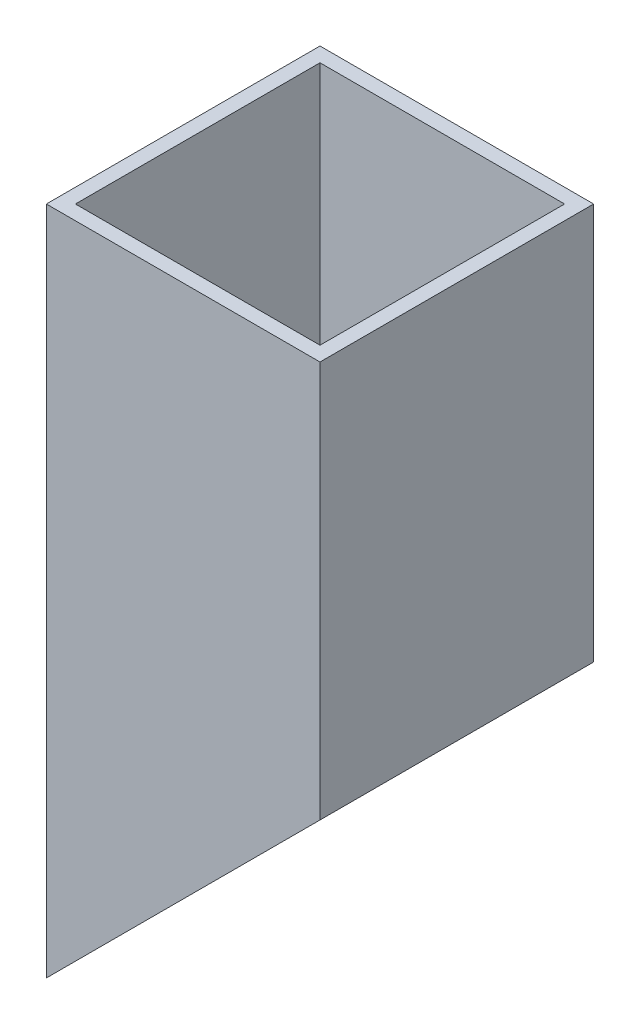
ISO-10303-21;
HEADER;
FILE_DESCRIPTION(('STEP AP214'),'2;1');
FILE_NAME('part.step','',(''),(''),'','','');
FILE_SCHEMA(('AUTOMOTIVE_DESIGN { 1 0 10303 214 1 1 1 1 }'));
ENDSEC;
DATA;
#1=APPLICATION_CONTEXT('core data for automotive mechanical design processes');
#2=APPLICATION_PROTOCOL_DEFINITION('international standard','automotive_design',2000,#1);
#3=PRODUCT_CONTEXT('',#1,'mechanical');
#4=PRODUCT('Part','Part','',(#3));
#5=PRODUCT_RELATED_PRODUCT_CATEGORY('part','',(#4));
#6=PRODUCT_DEFINITION_FORMATION('','',#4);
#7=PRODUCT_DEFINITION_CONTEXT('part definition',#1,'design');
#8=PRODUCT_DEFINITION('design','',#6,#7);
#9=PRODUCT_DEFINITION_SHAPE('','',#8);
#10=(LENGTH_UNIT() NAMED_UNIT(*) SI_UNIT(.MILLI.,.METRE.));
#11=(NAMED_UNIT(*) PLANE_ANGLE_UNIT() SI_UNIT($,.RADIAN.));
#12=(NAMED_UNIT(*) SI_UNIT($,.STERADIAN.) SOLID_ANGLE_UNIT());
#13=UNCERTAINTY_MEASURE_WITH_UNIT(LENGTH_MEASURE(1.E-05),#10,'distance_accuracy_value','');
#14=(GEOMETRIC_REPRESENTATION_CONTEXT(3) GLOBAL_UNCERTAINTY_ASSIGNED_CONTEXT((#13)) GLOBAL_UNIT_ASSIGNED_CONTEXT((#10,
#11,#12)) REPRESENTATION_CONTEXT('',''));
#15=CARTESIAN_POINT('',(0.,0.,0.));
#16=DIRECTION('',(0.,0.,1.));
#17=DIRECTION('',(1.,0.,0.));
#18=AXIS2_PLACEMENT_3D('',#15,#16,#17);
#19=CARTESIAN_POINT('',(0.,81.9,0.));
#20=DIRECTION('',(0.,-1.,0.));
#21=DIRECTION('',(0.,0.,-1.));
#22=AXIS2_PLACEMENT_3D('',#19,#20,#21);
#23=PLANE('',#22);
#24=DIRECTION('',(0.,0.,1.));
#25=VECTOR('',#24,1.);
#26=CARTESIAN_POINT('',(0.,81.9,0.));
#27=LINE('',#26,#25);
#28=CARTESIAN_POINT('',(0.,81.9,-56.5));
#29=VERTEX_POINT('',#28);
#30=CARTESIAN_POINT('',(0.,81.9,0.));
#31=VERTEX_POINT('',#30);
#32=EDGE_CURVE('E139',#29,#31,#27,.T.);
#33=ORIENTED_EDGE('',*,*,#32,.T.);
#34=DIRECTION('',(1.,0.,0.));
#35=VECTOR('',#34,1.);
#36=CARTESIAN_POINT('',(0.,81.9,0.));
#37=LINE('',#36,#35);
#38=CARTESIAN_POINT('',(56.5,81.9,0.));
#39=VERTEX_POINT('',#38);
#40=EDGE_CURVE('E142',#31,#39,#37,.T.);
#41=ORIENTED_EDGE('',*,*,#40,.T.);
#42=DIRECTION('',(0.,0.,-1.));
#43=VECTOR('',#42,1.);
#44=CARTESIAN_POINT('',(56.5,81.9,0.));
#45=LINE('',#44,#43);
#46=CARTESIAN_POINT('',(56.5,81.9,-56.5));
#47=VERTEX_POINT('',#46);
#48=EDGE_CURVE('E144',#39,#47,#45,.T.);
#49=ORIENTED_EDGE('',*,*,#48,.T.);
#50=DIRECTION('',(-1.,0.,0.));
#51=VECTOR('',#50,1.);
#52=CARTESIAN_POINT('',(0.,81.9,-56.5));
#53=LINE('',#52,#51);
#54=EDGE_CURVE('E146',#47,#29,#53,.T.);
#55=ORIENTED_EDGE('',*,*,#54,.T.);
#56=EDGE_LOOP('',(#33,#41,#49,#55));
#57=FACE_BOUND('',#56,.T.);
#58=DIRECTION('',(0.,0.,1.));
#59=VECTOR('',#58,1.);
#60=CARTESIAN_POINT('',(3.,81.9,0.));
#61=LINE('',#60,#59);
#62=CARTESIAN_POINT('',(2.99999999999999,81.9,-53.5));
#63=VERTEX_POINT('',#62);
#64=CARTESIAN_POINT('',(3.,81.9,-3.));
#65=VERTEX_POINT('',#64);
#66=EDGE_CURVE('E119',#63,#65,#61,.T.);
#67=ORIENTED_EDGE('',*,*,#66,.F.);
#68=DIRECTION('',(-1.,0.,0.));
#69=VECTOR('',#68,1.);
#70=CARTESIAN_POINT('',(0.,81.9,-53.5));
#71=LINE('',#70,#69);
#72=CARTESIAN_POINT('',(53.5,81.9,-53.5));
#73=VERTEX_POINT('',#72);
#74=EDGE_CURVE('E105',#73,#63,#71,.T.);
#75=ORIENTED_EDGE('',*,*,#74,.F.);
#76=DIRECTION('',(0.,0.,-1.));
#77=VECTOR('',#76,1.);
#78=CARTESIAN_POINT('',(53.5,81.9,0.));
#79=LINE('',#78,#77);
#80=CARTESIAN_POINT('',(53.5,81.9,-3.));
#81=VERTEX_POINT('',#80);
#82=EDGE_CURVE('E127',#81,#73,#79,.T.);
#83=ORIENTED_EDGE('',*,*,#82,.F.);
#84=DIRECTION('',(1.,0.,0.));
#85=VECTOR('',#84,1.);
#86=CARTESIAN_POINT('',(0.,81.9,-3.));
#87=LINE('',#86,#85);
#88=EDGE_CURVE('E125',#65,#81,#87,.T.);
#89=ORIENTED_EDGE('',*,*,#88,.F.);
#90=EDGE_LOOP('',(#67,#75,#83,#89));
#91=FACE_BOUND('',#90,.T.);
#92=ADVANCED_FACE('F35',(#57,#91),#23,.F.);
#93=CARTESIAN_POINT('',(0.,-56.4999999999994,-136.403066274079));
#94=DIRECTION('',(0.707106781186544,-0.707106781186551,0.));
#95=DIRECTION('',(0.707106781186551,0.707106781186544,0.));
#96=AXIS2_PLACEMENT_3D('',#93,#94,#95);
#97=PLANE('',#96);
#98=DIRECTION('',(-0.707106781186551,-0.707106781186544,0.));
#99=VECTOR('',#98,1.);
#100=CARTESIAN_POINT('',(0.,-56.4999999999994,-56.5));
#101=LINE('',#100,#99);
#102=CARTESIAN_POINT('',(56.5,0.,-56.5));
#103=VERTEX_POINT('',#102);
#104=CARTESIAN_POINT('',(0.,-56.4999999999994,-56.5));
#105=VERTEX_POINT('',#104);
#106=EDGE_CURVE('E130',#103,#105,#101,.T.);
#107=ORIENTED_EDGE('',*,*,#106,.F.);
#108=DIRECTION('',(0.,0.,-1.));
#109=VECTOR('',#108,1.);
#110=CARTESIAN_POINT('',(56.5,0.,0.));
#111=LINE('',#110,#109);
#112=CARTESIAN_POINT('',(56.5,0.,0.));
#113=VERTEX_POINT('',#112);
#114=EDGE_CURVE('E133',#113,#103,#111,.T.);
#115=ORIENTED_EDGE('',*,*,#114,.F.);
#116=DIRECTION('',(0.707106781186551,0.707106781186544,0.));
#117=VECTOR('',#116,1.);
#118=CARTESIAN_POINT('',(0.,-56.4999999999994,0.));
#119=LINE('',#118,#117);
#120=CARTESIAN_POINT('',(0.,-56.4999999999994,0.));
#121=VERTEX_POINT('',#120);
#122=EDGE_CURVE('E135',#121,#113,#119,.T.);
#123=ORIENTED_EDGE('',*,*,#122,.F.);
#124=DIRECTION('',(0.,0.,1.));
#125=VECTOR('',#124,1.);
#126=CARTESIAN_POINT('',(0.,-56.4999999999994,-136.403066274079));
#127=LINE('',#126,#125);
#128=EDGE_CURVE('E134',#105,#121,#127,.T.);
#129=ORIENTED_EDGE('',*,*,#128,.F.);
#130=EDGE_LOOP('',(#107,#115,#123,#129));
#131=FACE_BOUND('',#130,.T.);
#132=DIRECTION('',(0.,0.,-1.));
#133=VECTOR('',#132,1.);
#134=CARTESIAN_POINT('',(53.5,-2.99999999999998,-136.403066274079));
#135=LINE('',#134,#133);
#136=CARTESIAN_POINT('',(53.5,-2.99999999999997,-3.));
#137=VERTEX_POINT('',#136);
#138=CARTESIAN_POINT('',(53.5,-2.99999999999997,-53.5));
#139=VERTEX_POINT('',#138);
#140=EDGE_CURVE('E117',#137,#139,#135,.T.);
#141=ORIENTED_EDGE('',*,*,#140,.T.);
#142=DIRECTION('',(-0.707106781186551,-0.707106781186544,0.));
#143=VECTOR('',#142,1.);
#144=CARTESIAN_POINT('',(0.,-56.4999999999994,-53.5));
#145=LINE('',#144,#143);
#146=CARTESIAN_POINT('',(2.99999999999999,-53.4999999999995,-53.5));
#147=VERTEX_POINT('',#146);
#148=EDGE_CURVE('E103',#139,#147,#145,.T.);
#149=ORIENTED_EDGE('',*,*,#148,.T.);
#150=DIRECTION('',(0.,0.,1.));
#151=VECTOR('',#150,1.);
#152=CARTESIAN_POINT('',(2.99999999999998,-53.4999999999995,-136.403066274079));
#153=LINE('',#152,#151);
#154=CARTESIAN_POINT('',(3.,-53.4999999999994,-3.));
#155=VERTEX_POINT('',#154);
#156=EDGE_CURVE('E110',#147,#155,#153,.T.);
#157=ORIENTED_EDGE('',*,*,#156,.T.);
#158=DIRECTION('',(0.707106781186551,0.707106781186544,0.));
#159=VECTOR('',#158,1.);
#160=CARTESIAN_POINT('',(0.,-56.4999999999994,-3.));
#161=LINE('',#160,#159);
#162=EDGE_CURVE('E58',#155,#137,#161,.T.);
#163=ORIENTED_EDGE('',*,*,#162,.T.);
#164=EDGE_LOOP('',(#141,#149,#157,#163));
#165=FACE_BOUND('',#164,.T.);
#166=ADVANCED_FACE('F116',(#131,#165),#97,.T.);
#167=CARTESIAN_POINT('',(0.,81.9,0.));
#168=DIRECTION('',(1.,0.,0.));
#169=DIRECTION('',(0.,0.,-1.));
#170=AXIS2_PLACEMENT_3D('',#167,#168,#169);
#171=PLANE('',#170);
#172=DIRECTION('',(0.,-1.,0.));
#173=VECTOR('',#172,1.);
#174=CARTESIAN_POINT('',(0.,81.9,-56.5));
#175=LINE('',#174,#173);
#176=EDGE_CURVE('E148',#29,#105,#175,.T.);
#177=ORIENTED_EDGE('',*,*,#176,.T.);
#178=ORIENTED_EDGE('',*,*,#128,.T.);
#179=DIRECTION('',(0.,-1.,0.));
#180=VECTOR('',#179,1.);
#181=CARTESIAN_POINT('',(0.,81.9,0.));
#182=LINE('',#181,#180);
#183=EDGE_CURVE('E11',#31,#121,#182,.T.);
#184=ORIENTED_EDGE('',*,*,#183,.F.);
#185=ORIENTED_EDGE('',*,*,#32,.F.);
#186=EDGE_LOOP('',(#177,#178,#184,#185));
#187=FACE_BOUND('',#186,.T.);
#188=ADVANCED_FACE('F37',(#187),#171,.F.);
#189=CARTESIAN_POINT('',(0.,81.9,0.));
#190=DIRECTION('',(0.,0.,-1.));
#191=DIRECTION('',(-1.,0.,0.));
#192=AXIS2_PLACEMENT_3D('',#189,#190,#191);
#193=PLANE('',#192);
#194=ORIENTED_EDGE('',*,*,#183,.T.);
#195=ORIENTED_EDGE('',*,*,#122,.T.);
#196=DIRECTION('',(0.,-1.,0.));
#197=VECTOR('',#196,1.);
#198=CARTESIAN_POINT('',(56.5,81.9,0.));
#199=LINE('',#198,#197);
#200=EDGE_CURVE('E43',#39,#113,#199,.T.);
#201=ORIENTED_EDGE('',*,*,#200,.F.);
#202=ORIENTED_EDGE('',*,*,#40,.F.);
#203=EDGE_LOOP('',(#194,#195,#201,#202));
#204=FACE_BOUND('',#203,.T.);
#205=ADVANCED_FACE('F162',(#204),#193,.F.);
#206=CARTESIAN_POINT('',(56.5,81.9,0.));
#207=DIRECTION('',(-1.,0.,0.));
#208=DIRECTION('',(0.,0.,1.));
#209=AXIS2_PLACEMENT_3D('',#206,#207,#208);
#210=PLANE('',#209);
#211=ORIENTED_EDGE('',*,*,#114,.T.);
#212=DIRECTION('',(0.,-1.,0.));
#213=VECTOR('',#212,1.);
#214=CARTESIAN_POINT('',(56.5,81.9,-56.5));
#215=LINE('',#214,#213);
#216=EDGE_CURVE('E152',#47,#103,#215,.T.);
#217=ORIENTED_EDGE('',*,*,#216,.F.);
#218=ORIENTED_EDGE('',*,*,#48,.F.);
#219=ORIENTED_EDGE('',*,*,#200,.T.);
#220=EDGE_LOOP('',(#211,#217,#218,#219));
#221=FACE_BOUND('',#220,.T.);
#222=ADVANCED_FACE('F158',(#221),#210,.F.);
#223=CARTESIAN_POINT('',(0.,81.9,-56.5));
#224=DIRECTION('',(0.,0.,1.));
#225=DIRECTION('',(1.,0.,0.));
#226=AXIS2_PLACEMENT_3D('',#223,#224,#225);
#227=PLANE('',#226);
#228=ORIENTED_EDGE('',*,*,#216,.T.);
#229=ORIENTED_EDGE('',*,*,#106,.T.);
#230=ORIENTED_EDGE('',*,*,#176,.F.);
#231=ORIENTED_EDGE('',*,*,#54,.F.);
#232=EDGE_LOOP('',(#228,#229,#230,#231));
#233=FACE_BOUND('',#232,.T.);
#234=ADVANCED_FACE('F169',(#233),#227,.F.);
#235=CARTESIAN_POINT('',(3.,81.9,0.));
#236=DIRECTION('',(1.,0.,0.));
#237=DIRECTION('',(0.,0.,-1.));
#238=AXIS2_PLACEMENT_3D('',#235,#236,#237);
#239=PLANE('',#238);
#240=DIRECTION('',(0.,-1.,0.));
#241=VECTOR('',#240,1.);
#242=CARTESIAN_POINT('',(2.99999999999999,81.9,-53.5));
#243=LINE('',#242,#241);
#244=EDGE_CURVE('E99',#63,#147,#243,.T.);
#245=ORIENTED_EDGE('',*,*,#244,.F.);
#246=ORIENTED_EDGE('',*,*,#66,.T.);
#247=DIRECTION('',(0.,-1.,0.));
#248=VECTOR('',#247,1.);
#249=CARTESIAN_POINT('',(3.,81.9,-3.));
#250=LINE('',#249,#248);
#251=EDGE_CURVE('E112',#65,#155,#250,.T.);
#252=ORIENTED_EDGE('',*,*,#251,.T.);
#253=ORIENTED_EDGE('',*,*,#156,.F.);
#254=EDGE_LOOP('',(#245,#246,#252,#253));
#255=FACE_BOUND('',#254,.T.);
#256=ADVANCED_FACE('F111',(#255),#239,.T.);
#257=CARTESIAN_POINT('',(0.,81.9,-3.));
#258=DIRECTION('',(0.,0.,-1.));
#259=DIRECTION('',(-1.,0.,0.));
#260=AXIS2_PLACEMENT_3D('',#257,#258,#259);
#261=PLANE('',#260);
#262=ORIENTED_EDGE('',*,*,#251,.F.);
#263=ORIENTED_EDGE('',*,*,#88,.T.);
#264=DIRECTION('',(0.,-1.,0.));
#265=VECTOR('',#264,1.);
#266=CARTESIAN_POINT('',(53.5,81.9,-3.));
#267=LINE('',#266,#265);
#268=EDGE_CURVE('E301',#81,#137,#267,.T.);
#269=ORIENTED_EDGE('',*,*,#268,.T.);
#270=ORIENTED_EDGE('',*,*,#162,.F.);
#271=EDGE_LOOP('',(#262,#263,#269,#270));
#272=FACE_BOUND('',#271,.T.);
#273=ADVANCED_FACE('F206',(#272),#261,.T.);
#274=CARTESIAN_POINT('',(53.5,81.9,0.));
#275=DIRECTION('',(-1.,0.,0.));
#276=DIRECTION('',(0.,0.,1.));
#277=AXIS2_PLACEMENT_3D('',#274,#275,#276);
#278=PLANE('',#277);
#279=ORIENTED_EDGE('',*,*,#140,.F.);
#280=ORIENTED_EDGE('',*,*,#268,.F.);
#281=ORIENTED_EDGE('',*,*,#82,.T.);
#282=DIRECTION('',(0.,-1.,0.));
#283=VECTOR('',#282,1.);
#284=CARTESIAN_POINT('',(53.5,81.9,-53.5));
#285=LINE('',#284,#283);
#286=EDGE_CURVE('E50',#73,#139,#285,.T.);
#287=ORIENTED_EDGE('',*,*,#286,.T.);
#288=EDGE_LOOP('',(#279,#280,#281,#287));
#289=FACE_BOUND('',#288,.T.);
#290=ADVANCED_FACE('F214',(#289),#278,.T.);
#291=CARTESIAN_POINT('',(0.,81.9,-53.5));
#292=DIRECTION('',(0.,0.,1.));
#293=DIRECTION('',(1.,0.,0.));
#294=AXIS2_PLACEMENT_3D('',#291,#292,#293);
#295=PLANE('',#294);
#296=ORIENTED_EDGE('',*,*,#286,.F.);
#297=ORIENTED_EDGE('',*,*,#74,.T.);
#298=ORIENTED_EDGE('',*,*,#244,.T.);
#299=ORIENTED_EDGE('',*,*,#148,.F.);
#300=EDGE_LOOP('',(#296,#297,#298,#299));
#301=FACE_BOUND('',#300,.T.);
#302=ADVANCED_FACE('F101',(#301),#295,.T.);
#303=CLOSED_SHELL('',(#92,#166,#188,#205,#222,#234,#256,#273,#290,#302));
#304=MANIFOLD_SOLID_BREP('B2',#303);
#305=ADVANCED_BREP_SHAPE_REPRESENTATION('',(#18,#304),#14);
#306=SHAPE_DEFINITION_REPRESENTATION(#9,#305);
ENDSEC;
END-ISO-10303-21;
